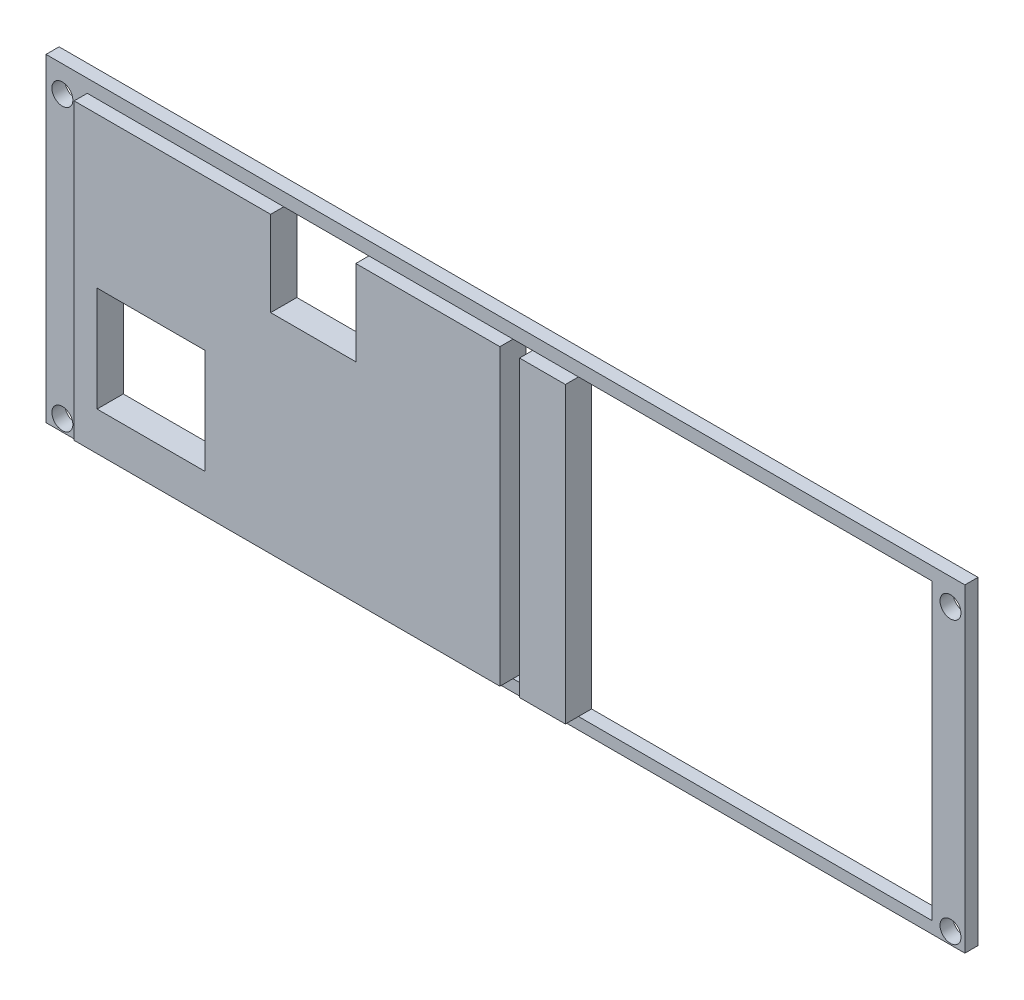
ISO-10303-21;
HEADER;
FILE_DESCRIPTION(('STEP AP214'),'2;1');
FILE_NAME('part.step','',(''),(''),'','','');
FILE_SCHEMA(('AUTOMOTIVE_DESIGN { 1 0 10303 214 1 1 1 1 }'));
ENDSEC;
DATA;
#1=APPLICATION_CONTEXT('core data for automotive mechanical design processes');
#2=APPLICATION_PROTOCOL_DEFINITION('international standard','automotive_design',2000,#1);
#3=PRODUCT_CONTEXT('',#1,'mechanical');
#4=PRODUCT('Part','Part','',(#3));
#5=PRODUCT_RELATED_PRODUCT_CATEGORY('part','',(#4));
#6=PRODUCT_DEFINITION_FORMATION('','',#4);
#7=PRODUCT_DEFINITION_CONTEXT('part definition',#1,'design');
#8=PRODUCT_DEFINITION('design','',#6,#7);
#9=PRODUCT_DEFINITION_SHAPE('','',#8);
#10=(LENGTH_UNIT() NAMED_UNIT(*) SI_UNIT(.MILLI.,.METRE.));
#11=(NAMED_UNIT(*) PLANE_ANGLE_UNIT() SI_UNIT($,.RADIAN.));
#12=(NAMED_UNIT(*) SI_UNIT($,.STERADIAN.) SOLID_ANGLE_UNIT());
#13=UNCERTAINTY_MEASURE_WITH_UNIT(LENGTH_MEASURE(1.E-05),#10,'distance_accuracy_value','');
#14=(GEOMETRIC_REPRESENTATION_CONTEXT(3) GLOBAL_UNCERTAINTY_ASSIGNED_CONTEXT((#13)) GLOBAL_UNIT_ASSIGNED_CONTEXT((#10,
#11,#12)) REPRESENTATION_CONTEXT('',''));
#15=CARTESIAN_POINT('',(0.,0.,0.));
#16=DIRECTION('',(0.,0.,1.));
#17=DIRECTION('',(1.,0.,0.));
#18=AXIS2_PLACEMENT_3D('',#15,#16,#17);
#19=CARTESIAN_POINT('',(0.,0.,0.));
#20=DIRECTION('',(0.,0.,-1.));
#21=DIRECTION('',(-1.,0.,0.));
#22=AXIS2_PLACEMENT_3D('',#19,#20,#21);
#23=PLANE('',#22);
#24=DIRECTION('',(0.,1.,0.));
#25=VECTOR('',#24,1.);
#26=CARTESIAN_POINT('',(9.8,0.,0.));
#27=LINE('',#26,#25);
#28=CARTESIAN_POINT('',(9.8,7.69999999999999,0.));
#29=VERTEX_POINT('',#28);
#30=CARTESIAN_POINT('',(9.80000000000001,23.7,0.));
#31=VERTEX_POINT('',#30);
#32=EDGE_CURVE('E219',#29,#31,#27,.T.);
#33=ORIENTED_EDGE('',*,*,#32,.F.);
#34=DIRECTION('',(-1.,0.,0.));
#35=VECTOR('',#34,1.);
#36=CARTESIAN_POINT('',(0.,7.69999999999999,0.));
#37=LINE('',#36,#35);
#38=CARTESIAN_POINT('',(26.3,7.69999999999999,0.));
#39=VERTEX_POINT('',#38);
#40=EDGE_CURVE('E224',#39,#29,#37,.T.);
#41=ORIENTED_EDGE('',*,*,#40,.F.);
#42=DIRECTION('',(0.,-1.,0.));
#43=VECTOR('',#42,1.);
#44=CARTESIAN_POINT('',(26.3,0.,0.));
#45=LINE('',#44,#43);
#46=CARTESIAN_POINT('',(26.3,23.7,0.));
#47=VERTEX_POINT('',#46);
#48=EDGE_CURVE('E220',#47,#39,#45,.T.);
#49=ORIENTED_EDGE('',*,*,#48,.F.);
#50=DIRECTION('',(-1.,0.,0.));
#51=VECTOR('',#50,1.);
#52=CARTESIAN_POINT('',(0.,23.7,0.));
#53=LINE('',#52,#51);
#54=EDGE_CURVE('E215',#47,#31,#53,.T.);
#55=ORIENTED_EDGE('',*,*,#54,.T.);
#56=EDGE_LOOP('',(#33,#41,#49,#55));
#57=FACE_BOUND('',#56,.T.);
#58=DIRECTION('',(-1.,0.,0.));
#59=VECTOR('',#58,1.);
#60=CARTESIAN_POINT('',(0.,46.7,0.));
#61=LINE('',#60,#59);
#62=CARTESIAN_POINT('',(74.3,46.7,0.));
#63=VERTEX_POINT('',#62);
#64=CARTESIAN_POINT('',(71.3,46.7,0.));
#65=VERTEX_POINT('',#64);
#66=EDGE_CURVE('E271',#63,#65,#61,.T.);
#67=ORIENTED_EDGE('',*,*,#66,.T.);
#68=DIRECTION('',(0.,-1.,0.));
#69=VECTOR('',#68,1.);
#70=CARTESIAN_POINT('',(71.3,0.,0.));
#71=LINE('',#70,#69);
#72=CARTESIAN_POINT('',(71.3,1.8,0.));
#73=VERTEX_POINT('',#72);
#74=EDGE_CURVE('E276',#65,#73,#71,.T.);
#75=ORIENTED_EDGE('',*,*,#74,.T.);
#76=DIRECTION('',(1.,0.,0.));
#77=VECTOR('',#76,1.);
#78=CARTESIAN_POINT('',(0.,1.8,0.));
#79=LINE('',#78,#77);
#80=CARTESIAN_POINT('',(74.3,1.8,0.));
#81=VERTEX_POINT('',#80);
#82=EDGE_CURVE('E54',#73,#81,#79,.T.);
#83=ORIENTED_EDGE('',*,*,#82,.T.);
#84=DIRECTION('',(0.,-1.,0.));
#85=VECTOR('',#84,1.);
#86=CARTESIAN_POINT('',(74.3,0.,0.));
#87=LINE('',#86,#85);
#88=EDGE_CURVE('E254',#63,#81,#87,.T.);
#89=ORIENTED_EDGE('',*,*,#88,.F.);
#90=EDGE_LOOP('',(#67,#75,#83,#89));
#91=FACE_BOUND('',#90,.T.);
#92=CARTESIAN_POINT('',(2.5,44.7,0.));
#93=DIRECTION('',(0.,0.,1.));
#94=DIRECTION('',(1.,0.,0.));
#95=AXIS2_PLACEMENT_3D('',#92,#93,#94);
#96=CIRCLE('',#95,1.6);
#97=CARTESIAN_POINT('',(4.1,44.7,0.));
#98=VERTEX_POINT('',#97);
#99=EDGE_CURVE('E248',#98,#98,#96,.T.);
#100=ORIENTED_EDGE('',*,*,#99,.T.);
#101=EDGE_LOOP('',(#100));
#102=FACE_BOUND('',#101,.T.);
#103=CARTESIAN_POINT('',(138.1,1.8,0.));
#104=DIRECTION('',(0.,0.,1.));
#105=DIRECTION('',(1.,0.,0.));
#106=AXIS2_PLACEMENT_3D('',#103,#104,#105);
#107=CIRCLE('',#106,1.59999999999999);
#108=CARTESIAN_POINT('',(139.7,1.8,0.));
#109=VERTEX_POINT('',#108);
#110=EDGE_CURVE('E234',#109,#109,#107,.T.);
#111=ORIENTED_EDGE('',*,*,#110,.T.);
#112=EDGE_LOOP('',(#111));
#113=FACE_BOUND('',#112,.T.);
#114=CARTESIAN_POINT('',(138.1,44.7,0.));
#115=DIRECTION('',(0.,0.,1.));
#116=DIRECTION('',(1.,0.,0.));
#117=AXIS2_PLACEMENT_3D('',#114,#115,#116);
#118=CIRCLE('',#117,1.59999999999999);
#119=CARTESIAN_POINT('',(139.7,44.7,0.));
#120=VERTEX_POINT('',#119);
#121=EDGE_CURVE('E244',#120,#120,#118,.T.);
#122=ORIENTED_EDGE('',*,*,#121,.T.);
#123=EDGE_LOOP('',(#122));
#124=FACE_BOUND('',#123,.T.);
#125=CARTESIAN_POINT('',(2.5,1.8,0.));
#126=DIRECTION('',(0.,0.,1.));
#127=DIRECTION('',(1.,0.,0.));
#128=AXIS2_PLACEMENT_3D('',#125,#126,#127);
#129=CIRCLE('',#128,1.6);
#130=CARTESIAN_POINT('',(4.1,1.8,0.));
#131=VERTEX_POINT('',#130);
#132=EDGE_CURVE('E245',#131,#131,#129,.T.);
#133=ORIENTED_EDGE('',*,*,#132,.T.);
#134=EDGE_LOOP('',(#133));
#135=FACE_BOUND('',#134,.T.);
#136=DIRECTION('',(-1.,0.,0.));
#137=VECTOR('',#136,1.);
#138=CARTESIAN_POINT('',(0.,46.7,0.));
#139=LINE('',#138,#137);
#140=CARTESIAN_POINT('',(135.3,46.7,0.));
#141=VERTEX_POINT('',#140);
#142=CARTESIAN_POINT('',(81.3,46.7,0.));
#143=VERTEX_POINT('',#142);
#144=EDGE_CURVE('E324',#141,#143,#139,.T.);
#145=ORIENTED_EDGE('',*,*,#144,.T.);
#146=DIRECTION('',(0.,-1.,0.));
#147=VECTOR('',#146,1.);
#148=CARTESIAN_POINT('',(81.3,0.,0.));
#149=LINE('',#148,#147);
#150=CARTESIAN_POINT('',(81.3,1.8,0.));
#151=VERTEX_POINT('',#150);
#152=EDGE_CURVE('E327',#143,#151,#149,.T.);
#153=ORIENTED_EDGE('',*,*,#152,.T.);
#154=DIRECTION('',(1.,0.,0.));
#155=VECTOR('',#154,1.);
#156=CARTESIAN_POINT('',(0.,1.8,0.));
#157=LINE('',#156,#155);
#158=CARTESIAN_POINT('',(135.3,1.8,0.));
#159=VERTEX_POINT('',#158);
#160=EDGE_CURVE('E330',#151,#159,#157,.T.);
#161=ORIENTED_EDGE('',*,*,#160,.T.);
#162=DIRECTION('',(0.,1.,0.));
#163=VECTOR('',#162,1.);
#164=CARTESIAN_POINT('',(135.3,0.,0.));
#165=LINE('',#164,#163);
#166=EDGE_CURVE('E333',#159,#141,#165,.T.);
#167=ORIENTED_EDGE('',*,*,#166,.T.);
#168=EDGE_LOOP('',(#145,#153,#161,#167));
#169=FACE_BOUND('',#168,.T.);
#170=DIRECTION('',(0.,-1.,0.));
#171=VECTOR('',#170,1.);
#172=CARTESIAN_POINT('',(0.,0.,0.));
#173=LINE('',#172,#171);
#174=CARTESIAN_POINT('',(0.,48.7,0.));
#175=VERTEX_POINT('',#174);
#176=CARTESIAN_POINT('',(0.,0.,0.));
#177=VERTEX_POINT('',#176);
#178=EDGE_CURVE('E410',#175,#177,#173,.T.);
#179=ORIENTED_EDGE('',*,*,#178,.F.);
#180=DIRECTION('',(-1.,0.,0.));
#181=VECTOR('',#180,1.);
#182=CARTESIAN_POINT('',(0.,48.7,0.));
#183=LINE('',#182,#181);
#184=CARTESIAN_POINT('',(140.3,48.7,0.));
#185=VERTEX_POINT('',#184);
#186=EDGE_CURVE('E420',#185,#175,#183,.T.);
#187=ORIENTED_EDGE('',*,*,#186,.F.);
#188=DIRECTION('',(0.,1.,0.));
#189=VECTOR('',#188,1.);
#190=CARTESIAN_POINT('',(140.3,0.,0.));
#191=LINE('',#190,#189);
#192=CARTESIAN_POINT('',(140.3,0.,0.));
#193=VERTEX_POINT('',#192);
#194=EDGE_CURVE('E417',#193,#185,#191,.T.);
#195=ORIENTED_EDGE('',*,*,#194,.F.);
#196=DIRECTION('',(1.,0.,0.));
#197=VECTOR('',#196,1.);
#198=CARTESIAN_POINT('',(0.,0.,0.));
#199=LINE('',#198,#197);
#200=EDGE_CURVE('E414',#177,#193,#199,.T.);
#201=ORIENTED_EDGE('',*,*,#200,.F.);
#202=EDGE_LOOP('',(#179,#187,#195,#201));
#203=FACE_BOUND('',#202,.T.);
#204=DIRECTION('',(-1.,0.,0.));
#205=VECTOR('',#204,1.);
#206=CARTESIAN_POINT('',(0.,46.7,0.));
#207=LINE('',#206,#205);
#208=CARTESIAN_POINT('',(49.3,46.7,0.));
#209=VERTEX_POINT('',#208);
#210=CARTESIAN_POINT('',(36.3,46.7,0.));
#211=VERTEX_POINT('',#210);
#212=EDGE_CURVE('E284',#209,#211,#207,.T.);
#213=ORIENTED_EDGE('',*,*,#212,.T.);
#214=DIRECTION('',(0.,1.,0.));
#215=VECTOR('',#214,1.);
#216=CARTESIAN_POINT('',(36.3,0.,0.));
#217=LINE('',#216,#215);
#218=CARTESIAN_POINT('',(36.3,33.7,0.));
#219=VERTEX_POINT('',#218);
#220=EDGE_CURVE('E298',#219,#211,#217,.T.);
#221=ORIENTED_EDGE('',*,*,#220,.F.);
#222=DIRECTION('',(-1.,0.,0.));
#223=VECTOR('',#222,1.);
#224=CARTESIAN_POINT('',(0.,33.7,0.));
#225=LINE('',#224,#223);
#226=CARTESIAN_POINT('',(49.3,33.7,0.));
#227=VERTEX_POINT('',#226);
#228=EDGE_CURVE('E308',#227,#219,#225,.T.);
#229=ORIENTED_EDGE('',*,*,#228,.F.);
#230=DIRECTION('',(0.,-1.,0.));
#231=VECTOR('',#230,1.);
#232=CARTESIAN_POINT('',(49.3,0.,0.));
#233=LINE('',#232,#231);
#234=EDGE_CURVE('E306',#209,#227,#233,.T.);
#235=ORIENTED_EDGE('',*,*,#234,.F.);
#236=EDGE_LOOP('',(#213,#221,#229,#235));
#237=FACE_BOUND('',#236,.T.);
#238=ADVANCED_FACE('F39',(#57,#91,#102,#113,#124,#135,#169,#203,#237),#23,.T.);
#239=CARTESIAN_POINT('',(0.,46.7,2.));
#240=DIRECTION('',(0.,-1.,0.));
#241=DIRECTION('',(0.,0.,-1.));
#242=AXIS2_PLACEMENT_3D('',#239,#240,#241);
#243=PLANE('',#242);
#244=DIRECTION('',(0.,0.,1.));
#245=VECTOR('',#244,1.);
#246=CARTESIAN_POINT('',(74.3,46.7,0.));
#247=LINE('',#246,#245);
#248=CARTESIAN_POINT('',(74.3,46.7,2.));
#249=VERTEX_POINT('',#248);
#250=CARTESIAN_POINT('',(74.3,46.7,4.));
#251=VERTEX_POINT('',#250);
#252=EDGE_CURVE('E266',#249,#251,#247,.T.);
#253=ORIENTED_EDGE('',*,*,#252,.T.);
#254=DIRECTION('',(1.,0.,0.));
#255=VECTOR('',#254,1.);
#256=CARTESIAN_POINT('',(0.,46.7,4.));
#257=LINE('',#256,#255);
#258=CARTESIAN_POINT('',(81.3,46.7,4.));
#259=VERTEX_POINT('',#258);
#260=EDGE_CURVE('E404',#251,#259,#257,.T.);
#261=ORIENTED_EDGE('',*,*,#260,.T.);
#262=DIRECTION('',(0.,0.,1.));
#263=VECTOR('',#262,1.);
#264=CARTESIAN_POINT('',(81.3,46.7,0.));
#265=LINE('',#264,#263);
#266=CARTESIAN_POINT('',(81.3,46.7,2.));
#267=VERTEX_POINT('',#266);
#268=EDGE_CURVE('E336',#267,#259,#265,.T.);
#269=ORIENTED_EDGE('',*,*,#268,.F.);
#270=DIRECTION('',(1.,0.,0.));
#271=VECTOR('',#270,1.);
#272=CARTESIAN_POINT('',(0.,46.7,2.));
#273=LINE('',#272,#271);
#274=EDGE_CURVE('E384',#249,#267,#273,.T.);
#275=ORIENTED_EDGE('',*,*,#274,.F.);
#276=EDGE_LOOP('',(#253,#261,#269,#275));
#277=FACE_BOUND('',#276,.T.);
#278=ADVANCED_FACE('F471',(#277),#243,.F.);
#279=DIRECTION('',(0.,0.,1.));
#280=VECTOR('',#279,1.);
#281=CARTESIAN_POINT('',(36.3,46.7,0.));
#282=LINE('',#281,#280);
#283=CARTESIAN_POINT('',(36.3,46.7,2.));
#284=VERTEX_POINT('',#283);
#285=CARTESIAN_POINT('',(36.3,46.7,4.));
#286=VERTEX_POINT('',#285);
#287=EDGE_CURVE('E293',#284,#286,#282,.T.);
#288=ORIENTED_EDGE('',*,*,#287,.F.);
#289=CARTESIAN_POINT('',(6.3,46.7,2.));
#290=VERTEX_POINT('',#289);
#291=EDGE_CURVE('E385',#290,#284,#273,.T.);
#292=ORIENTED_EDGE('',*,*,#291,.F.);
#293=DIRECTION('',(0.,0.,1.));
#294=VECTOR('',#293,1.);
#295=CARTESIAN_POINT('',(6.3,46.7,2.));
#296=LINE('',#295,#294);
#297=CARTESIAN_POINT('',(6.3,46.7,4.));
#298=VERTEX_POINT('',#297);
#299=EDGE_CURVE('E408',#290,#298,#296,.T.);
#300=ORIENTED_EDGE('',*,*,#299,.T.);
#301=EDGE_CURVE('E377',#298,#286,#257,.T.);
#302=ORIENTED_EDGE('',*,*,#301,.T.);
#303=EDGE_LOOP('',(#288,#292,#300,#302));
#304=FACE_BOUND('',#303,.T.);
#305=ADVANCED_FACE('F478',(#304),#243,.F.);
#306=CARTESIAN_POINT('',(49.3,46.7,4.));
#307=VERTEX_POINT('',#306);
#308=CARTESIAN_POINT('',(71.3,46.7,4.));
#309=VERTEX_POINT('',#308);
#310=EDGE_CURVE('E407',#307,#309,#257,.T.);
#311=ORIENTED_EDGE('',*,*,#310,.T.);
#312=DIRECTION('',(0.,0.,1.));
#313=VECTOR('',#312,1.);
#314=CARTESIAN_POINT('',(71.3,46.7,0.));
#315=LINE('',#314,#313);
#316=CARTESIAN_POINT('',(71.3,46.7,2.));
#317=VERTEX_POINT('',#316);
#318=EDGE_CURVE('E255',#317,#309,#315,.T.);
#319=ORIENTED_EDGE('',*,*,#318,.F.);
#320=CARTESIAN_POINT('',(49.3,46.7,2.));
#321=VERTEX_POINT('',#320);
#322=EDGE_CURVE('E389',#321,#317,#273,.T.);
#323=ORIENTED_EDGE('',*,*,#322,.F.);
#324=DIRECTION('',(0.,0.,1.));
#325=VECTOR('',#324,1.);
#326=CARTESIAN_POINT('',(49.3,46.7,0.));
#327=LINE('',#326,#325);
#328=EDGE_CURVE('E289',#321,#307,#327,.T.);
#329=ORIENTED_EDGE('',*,*,#328,.T.);
#330=EDGE_LOOP('',(#311,#319,#323,#329));
#331=FACE_BOUND('',#330,.T.);
#332=ADVANCED_FACE('F480',(#331),#243,.F.);
#333=CARTESIAN_POINT('',(0.,1.8,2.));
#334=DIRECTION('',(0.,-1.,0.));
#335=DIRECTION('',(0.,0.,-1.));
#336=AXIS2_PLACEMENT_3D('',#333,#334,#335);
#337=PLANE('',#336);
#338=DIRECTION('',(1.,0.,0.));
#339=VECTOR('',#338,1.);
#340=CARTESIAN_POINT('',(0.,1.8,4.));
#341=LINE('',#340,#339);
#342=CARTESIAN_POINT('',(74.3,1.8,4.));
#343=VERTEX_POINT('',#342);
#344=CARTESIAN_POINT('',(81.3,1.8,4.));
#345=VERTEX_POINT('',#344);
#346=EDGE_CURVE('E373',#343,#345,#341,.T.);
#347=ORIENTED_EDGE('',*,*,#346,.F.);
#348=DIRECTION('',(0.,0.,1.));
#349=VECTOR('',#348,1.);
#350=CARTESIAN_POINT('',(74.3,1.8,0.));
#351=LINE('',#350,#349);
#352=CARTESIAN_POINT('',(74.3,1.8,2.));
#353=VERTEX_POINT('',#352);
#354=EDGE_CURVE('E262',#353,#343,#351,.T.);
#355=ORIENTED_EDGE('',*,*,#354,.F.);
#356=DIRECTION('',(1.,0.,0.));
#357=VECTOR('',#356,1.);
#358=CARTESIAN_POINT('',(0.,1.8,2.));
#359=LINE('',#358,#357);
#360=CARTESIAN_POINT('',(81.3,1.8,2.));
#361=VERTEX_POINT('',#360);
#362=EDGE_CURVE('E376',#353,#361,#359,.T.);
#363=ORIENTED_EDGE('',*,*,#362,.T.);
#364=DIRECTION('',(0.,0.,1.));
#365=VECTOR('',#364,1.);
#366=CARTESIAN_POINT('',(81.3,1.8,0.));
#367=LINE('',#366,#365);
#368=EDGE_CURVE('E348',#361,#345,#367,.T.);
#369=ORIENTED_EDGE('',*,*,#368,.T.);
#370=EDGE_LOOP('',(#347,#355,#363,#369));
#371=FACE_BOUND('',#370,.T.);
#372=ADVANCED_FACE('F466',(#371),#337,.T.);
#373=CARTESIAN_POINT('',(0.,0.,4.));
#374=DIRECTION('',(0.,0.,-1.));
#375=DIRECTION('',(-1.,0.,0.));
#376=AXIS2_PLACEMENT_3D('',#373,#374,#375);
#377=PLANE('',#376);
#378=DIRECTION('',(0.,-1.,0.));
#379=VECTOR('',#378,1.);
#380=CARTESIAN_POINT('',(74.3,0.,4.));
#381=LINE('',#380,#379);
#382=EDGE_CURVE('E267',#251,#343,#381,.T.);
#383=ORIENTED_EDGE('',*,*,#382,.T.);
#384=ORIENTED_EDGE('',*,*,#346,.T.);
#385=DIRECTION('',(0.,-1.,0.));
#386=VECTOR('',#385,1.);
#387=CARTESIAN_POINT('',(81.3,0.,4.));
#388=LINE('',#387,#386);
#389=EDGE_CURVE('E273',#259,#345,#388,.T.);
#390=ORIENTED_EDGE('',*,*,#389,.F.);
#391=ORIENTED_EDGE('',*,*,#260,.F.);
#392=EDGE_LOOP('',(#383,#384,#390,#391));
#393=FACE_BOUND('',#392,.T.);
#394=ADVANCED_FACE('F483',(#393),#377,.F.);
#395=DIRECTION('',(-1.,0.,0.));
#396=VECTOR('',#395,1.);
#397=CARTESIAN_POINT('',(0.,7.69999999999999,4.));
#398=LINE('',#397,#396);
#399=CARTESIAN_POINT('',(26.3,7.69999999999999,4.));
#400=VERTEX_POINT('',#399);
#401=CARTESIAN_POINT('',(9.8,7.69999999999999,4.));
#402=VERTEX_POINT('',#401);
#403=EDGE_CURVE('E317',#400,#402,#398,.T.);
#404=ORIENTED_EDGE('',*,*,#403,.T.);
#405=DIRECTION('',(0.,1.,0.));
#406=VECTOR('',#405,1.);
#407=CARTESIAN_POINT('',(9.8,0.,4.));
#408=LINE('',#407,#406);
#409=CARTESIAN_POINT('',(9.80000000000001,23.7,4.));
#410=VERTEX_POINT('',#409);
#411=EDGE_CURVE('E11',#402,#410,#408,.T.);
#412=ORIENTED_EDGE('',*,*,#411,.T.);
#413=DIRECTION('',(-1.,0.,0.));
#414=VECTOR('',#413,1.);
#415=CARTESIAN_POINT('',(0.,23.7,4.));
#416=LINE('',#415,#414);
#417=CARTESIAN_POINT('',(26.3,23.7,4.));
#418=VERTEX_POINT('',#417);
#419=EDGE_CURVE('E238',#418,#410,#416,.T.);
#420=ORIENTED_EDGE('',*,*,#419,.F.);
#421=DIRECTION('',(0.,-1.,0.));
#422=VECTOR('',#421,1.);
#423=CARTESIAN_POINT('',(26.3,0.,4.));
#424=LINE('',#423,#422);
#425=EDGE_CURVE('E223',#418,#400,#424,.T.);
#426=ORIENTED_EDGE('',*,*,#425,.T.);
#427=EDGE_LOOP('',(#404,#412,#420,#426));
#428=FACE_BOUND('',#427,.T.);
#429=CARTESIAN_POINT('',(6.3,1.8,4.));
#430=VERTEX_POINT('',#429);
#431=CARTESIAN_POINT('',(71.3,1.8,4.));
#432=VERTEX_POINT('',#431);
#433=EDGE_CURVE('E398',#430,#432,#341,.T.);
#434=ORIENTED_EDGE('',*,*,#433,.T.);
#435=DIRECTION('',(0.,-1.,0.));
#436=VECTOR('',#435,1.);
#437=CARTESIAN_POINT('',(71.3,0.,4.));
#438=LINE('',#437,#436);
#439=EDGE_CURVE('E270',#309,#432,#438,.T.);
#440=ORIENTED_EDGE('',*,*,#439,.F.);
#441=ORIENTED_EDGE('',*,*,#310,.F.);
#442=DIRECTION('',(0.,-1.,0.));
#443=VECTOR('',#442,1.);
#444=CARTESIAN_POINT('',(49.3,0.,4.));
#445=LINE('',#444,#443);
#446=CARTESIAN_POINT('',(49.3,33.7,4.));
#447=VERTEX_POINT('',#446);
#448=EDGE_CURVE('E294',#307,#447,#445,.T.);
#449=ORIENTED_EDGE('',*,*,#448,.T.);
#450=DIRECTION('',(-1.,0.,0.));
#451=VECTOR('',#450,1.);
#452=CARTESIAN_POINT('',(0.,33.7,4.));
#453=LINE('',#452,#451);
#454=CARTESIAN_POINT('',(36.3,33.7,4.));
#455=VERTEX_POINT('',#454);
#456=EDGE_CURVE('E297',#447,#455,#453,.T.);
#457=ORIENTED_EDGE('',*,*,#456,.T.);
#458=DIRECTION('',(0.,1.,0.));
#459=VECTOR('',#458,1.);
#460=CARTESIAN_POINT('',(36.3,0.,4.));
#461=LINE('',#460,#459);
#462=EDGE_CURVE('E301',#455,#286,#461,.T.);
#463=ORIENTED_EDGE('',*,*,#462,.T.);
#464=ORIENTED_EDGE('',*,*,#301,.F.);
#465=DIRECTION('',(0.,1.,0.));
#466=VECTOR('',#465,1.);
#467=CARTESIAN_POINT('',(6.3,0.,4.));
#468=LINE('',#467,#466);
#469=EDGE_CURVE('E401',#430,#298,#468,.T.);
#470=ORIENTED_EDGE('',*,*,#469,.F.);
#471=EDGE_LOOP('',(#434,#440,#441,#449,#457,#463,#464,#470));
#472=FACE_BOUND('',#471,.T.);
#473=ADVANCED_FACE('F491',(#428,#472),#377,.F.);
#474=CARTESIAN_POINT('',(0.,0.,4.));
#475=DIRECTION('',(1.,0.,0.));
#476=DIRECTION('',(0.,0.,-1.));
#477=AXIS2_PLACEMENT_3D('',#474,#475,#476);
#478=PLANE('',#477);
#479=DIRECTION('',(0.,-1.,0.));
#480=VECTOR('',#479,1.);
#481=CARTESIAN_POINT('',(0.,0.,2.));
#482=LINE('',#481,#480);
#483=CARTESIAN_POINT('',(0.,48.7,2.));
#484=VERTEX_POINT('',#483);
#485=CARTESIAN_POINT('',(0.,0.,2.));
#486=VERTEX_POINT('',#485);
#487=EDGE_CURVE('E391',#484,#486,#482,.T.);
#488=ORIENTED_EDGE('',*,*,#487,.F.);
#489=DIRECTION('',(0.,0.,-1.));
#490=VECTOR('',#489,1.);
#491=CARTESIAN_POINT('',(0.,48.7,4.));
#492=LINE('',#491,#490);
#493=EDGE_CURVE('E423',#484,#175,#492,.T.);
#494=ORIENTED_EDGE('',*,*,#493,.T.);
#495=ORIENTED_EDGE('',*,*,#178,.T.);
#496=DIRECTION('',(0.,0.,-1.));
#497=VECTOR('',#496,1.);
#498=CARTESIAN_POINT('',(0.,0.,4.));
#499=LINE('',#498,#497);
#500=EDGE_CURVE('E47',#486,#177,#499,.T.);
#501=ORIENTED_EDGE('',*,*,#500,.F.);
#502=EDGE_LOOP('',(#488,#494,#495,#501));
#503=FACE_BOUND('',#502,.T.);
#504=ADVANCED_FACE('F41',(#503),#478,.F.);
#505=CARTESIAN_POINT('',(0.,0.,4.));
#506=DIRECTION('',(0.,1.,0.));
#507=DIRECTION('',(0.,0.,1.));
#508=AXIS2_PLACEMENT_3D('',#505,#506,#507);
#509=PLANE('',#508);
#510=DIRECTION('',(1.,0.,0.));
#511=VECTOR('',#510,1.);
#512=CARTESIAN_POINT('',(0.,0.,2.));
#513=LINE('',#512,#511);
#514=CARTESIAN_POINT('',(140.3,0.,2.));
#515=VERTEX_POINT('',#514);
#516=EDGE_CURVE('E393',#486,#515,#513,.T.);
#517=ORIENTED_EDGE('',*,*,#516,.F.);
#518=ORIENTED_EDGE('',*,*,#500,.T.);
#519=ORIENTED_EDGE('',*,*,#200,.T.);
#520=DIRECTION('',(0.,0.,-1.));
#521=VECTOR('',#520,1.);
#522=CARTESIAN_POINT('',(140.3,0.,4.));
#523=LINE('',#522,#521);
#524=EDGE_CURVE('E427',#515,#193,#523,.T.);
#525=ORIENTED_EDGE('',*,*,#524,.F.);
#526=EDGE_LOOP('',(#517,#518,#519,#525));
#527=FACE_BOUND('',#526,.T.);
#528=ADVANCED_FACE('F432',(#527),#509,.F.);
#529=CARTESIAN_POINT('',(140.3,0.,4.));
#530=DIRECTION('',(-1.,0.,0.));
#531=DIRECTION('',(0.,0.,1.));
#532=AXIS2_PLACEMENT_3D('',#529,#530,#531);
#533=PLANE('',#532);
#534=DIRECTION('',(0.,1.,0.));
#535=VECTOR('',#534,1.);
#536=CARTESIAN_POINT('',(140.3,0.,2.));
#537=LINE('',#536,#535);
#538=CARTESIAN_POINT('',(140.3,48.7,2.));
#539=VERTEX_POINT('',#538);
#540=EDGE_CURVE('E395',#515,#539,#537,.T.);
#541=ORIENTED_EDGE('',*,*,#540,.F.);
#542=ORIENTED_EDGE('',*,*,#524,.T.);
#543=ORIENTED_EDGE('',*,*,#194,.T.);
#544=DIRECTION('',(0.,0.,-1.));
#545=VECTOR('',#544,1.);
#546=CARTESIAN_POINT('',(140.3,48.7,4.));
#547=LINE('',#546,#545);
#548=EDGE_CURVE('E425',#539,#185,#547,.T.);
#549=ORIENTED_EDGE('',*,*,#548,.F.);
#550=EDGE_LOOP('',(#541,#542,#543,#549));
#551=FACE_BOUND('',#550,.T.);
#552=ADVANCED_FACE('F448',(#551),#533,.F.);
#553=CARTESIAN_POINT('',(0.,48.7,4.));
#554=DIRECTION('',(0.,-1.,0.));
#555=DIRECTION('',(0.,0.,-1.));
#556=AXIS2_PLACEMENT_3D('',#553,#554,#555);
#557=PLANE('',#556);
#558=DIRECTION('',(-1.,0.,0.));
#559=VECTOR('',#558,1.);
#560=CARTESIAN_POINT('',(0.,48.7,2.));
#561=LINE('',#560,#559);
#562=EDGE_CURVE('E388',#539,#484,#561,.T.);
#563=ORIENTED_EDGE('',*,*,#562,.F.);
#564=ORIENTED_EDGE('',*,*,#548,.T.);
#565=ORIENTED_EDGE('',*,*,#186,.T.);
#566=ORIENTED_EDGE('',*,*,#493,.F.);
#567=EDGE_LOOP('',(#563,#564,#565,#566));
#568=FACE_BOUND('',#567,.T.);
#569=ADVANCED_FACE('F444',(#568),#557,.F.);
#570=CARTESIAN_POINT('',(6.3,0.,2.));
#571=DIRECTION('',(1.,0.,0.));
#572=DIRECTION('',(0.,0.,-1.));
#573=AXIS2_PLACEMENT_3D('',#570,#571,#572);
#574=PLANE('',#573);
#575=ORIENTED_EDGE('',*,*,#469,.T.);
#576=ORIENTED_EDGE('',*,*,#299,.F.);
#577=DIRECTION('',(0.,1.,0.));
#578=VECTOR('',#577,1.);
#579=CARTESIAN_POINT('',(6.3,0.,2.));
#580=LINE('',#579,#578);
#581=CARTESIAN_POINT('',(6.3,1.8,2.));
#582=VERTEX_POINT('',#581);
#583=EDGE_CURVE('E381',#582,#290,#580,.T.);
#584=ORIENTED_EDGE('',*,*,#583,.F.);
#585=DIRECTION('',(0.,0.,1.));
#586=VECTOR('',#585,1.);
#587=CARTESIAN_POINT('',(6.3,1.8,2.));
#588=LINE('',#587,#586);
#589=EDGE_CURVE('E397',#582,#430,#588,.T.);
#590=ORIENTED_EDGE('',*,*,#589,.T.);
#591=EDGE_LOOP('',(#575,#576,#584,#590));
#592=FACE_BOUND('',#591,.T.);
#593=ADVANCED_FACE('F463',(#592),#574,.F.);
#594=DIRECTION('',(0.,0.,1.));
#595=VECTOR('',#594,1.);
#596=CARTESIAN_POINT('',(71.3,1.8,0.));
#597=LINE('',#596,#595);
#598=CARTESIAN_POINT('',(71.3,1.8,2.));
#599=VERTEX_POINT('',#598);
#600=EDGE_CURVE('E258',#599,#432,#597,.T.);
#601=ORIENTED_EDGE('',*,*,#600,.T.);
#602=ORIENTED_EDGE('',*,*,#433,.F.);
#603=ORIENTED_EDGE('',*,*,#589,.F.);
#604=EDGE_CURVE('E378',#582,#599,#359,.T.);
#605=ORIENTED_EDGE('',*,*,#604,.T.);
#606=EDGE_LOOP('',(#601,#602,#603,#605));
#607=FACE_BOUND('',#606,.T.);
#608=ADVANCED_FACE('F453',(#607),#337,.T.);
#609=CARTESIAN_POINT('',(0.,0.,2.));
#610=DIRECTION('',(0.,0.,1.));
#611=DIRECTION('',(1.,0.,0.));
#612=AXIS2_PLACEMENT_3D('',#609,#610,#611);
#613=PLANE('',#612);
#614=CARTESIAN_POINT('',(138.1,1.8,2.));
#615=DIRECTION('',(0.,0.,1.));
#616=DIRECTION('',(1.,0.,0.));
#617=AXIS2_PLACEMENT_3D('',#614,#615,#616);
#618=CIRCLE('',#617,1.59999999999999);
#619=CARTESIAN_POINT('',(139.7,1.8,2.));
#620=VERTEX_POINT('',#619);
#621=EDGE_CURVE('E341',#620,#620,#618,.T.);
#622=ORIENTED_EDGE('',*,*,#621,.F.);
#623=EDGE_LOOP('',(#622));
#624=FACE_BOUND('',#623,.T.);
#625=CARTESIAN_POINT('',(138.1,44.7,2.));
#626=DIRECTION('',(0.,0.,1.));
#627=DIRECTION('',(1.,0.,0.));
#628=AXIS2_PLACEMENT_3D('',#625,#626,#627);
#629=CIRCLE('',#628,1.59999999999999);
#630=CARTESIAN_POINT('',(139.7,44.7,2.));
#631=VERTEX_POINT('',#630);
#632=EDGE_CURVE('E370',#631,#631,#629,.T.);
#633=ORIENTED_EDGE('',*,*,#632,.F.);
#634=EDGE_LOOP('',(#633));
#635=FACE_BOUND('',#634,.T.);
#636=CARTESIAN_POINT('',(2.5,1.8,2.));
#637=DIRECTION('',(0.,0.,1.));
#638=DIRECTION('',(1.,0.,0.));
#639=AXIS2_PLACEMENT_3D('',#636,#637,#638);
#640=CIRCLE('',#639,1.6);
#641=CARTESIAN_POINT('',(4.1,1.8,2.));
#642=VERTEX_POINT('',#641);
#643=EDGE_CURVE('E367',#642,#642,#640,.T.);
#644=ORIENTED_EDGE('',*,*,#643,.F.);
#645=EDGE_LOOP('',(#644));
#646=FACE_BOUND('',#645,.T.);
#647=CARTESIAN_POINT('',(2.5,44.7,2.));
#648=DIRECTION('',(0.,0.,1.));
#649=DIRECTION('',(1.,0.,0.));
#650=AXIS2_PLACEMENT_3D('',#647,#648,#649);
#651=CIRCLE('',#650,1.6);
#652=CARTESIAN_POINT('',(4.1,44.7,2.));
#653=VERTEX_POINT('',#652);
#654=EDGE_CURVE('E364',#653,#653,#651,.T.);
#655=ORIENTED_EDGE('',*,*,#654,.F.);
#656=EDGE_LOOP('',(#655));
#657=FACE_BOUND('',#656,.T.);
#658=DIRECTION('',(0.,1.,0.));
#659=VECTOR('',#658,1.);
#660=CARTESIAN_POINT('',(135.3,0.,2.));
#661=LINE('',#660,#659);
#662=CARTESIAN_POINT('',(135.3,1.8,2.));
#663=VERTEX_POINT('',#662);
#664=CARTESIAN_POINT('',(135.3,46.7,2.));
#665=VERTEX_POINT('',#664);
#666=EDGE_CURVE('E374',#663,#665,#661,.T.);
#667=ORIENTED_EDGE('',*,*,#666,.F.);
#668=DIRECTION('',(1.,0.,0.));
#669=VECTOR('',#668,1.);
#670=CARTESIAN_POINT('',(0.,1.8,2.));
#671=LINE('',#670,#669);
#672=EDGE_CURVE('E354',#361,#663,#671,.T.);
#673=ORIENTED_EDGE('',*,*,#672,.F.);
#674=ORIENTED_EDGE('',*,*,#362,.F.);
#675=DIRECTION('',(1.,0.,0.));
#676=VECTOR('',#675,1.);
#677=CARTESIAN_POINT('',(0.,1.8,2.));
#678=LINE('',#677,#676);
#679=EDGE_CURVE('E360',#599,#353,#678,.T.);
#680=ORIENTED_EDGE('',*,*,#679,.F.);
#681=ORIENTED_EDGE('',*,*,#604,.F.);
#682=ORIENTED_EDGE('',*,*,#583,.T.);
#683=ORIENTED_EDGE('',*,*,#291,.T.);
#684=DIRECTION('',(-1.,0.,0.));
#685=VECTOR('',#684,1.);
#686=CARTESIAN_POINT('',(0.,46.7,2.));
#687=LINE('',#686,#685);
#688=EDGE_CURVE('E358',#321,#284,#687,.T.);
#689=ORIENTED_EDGE('',*,*,#688,.F.);
#690=ORIENTED_EDGE('',*,*,#322,.T.);
#691=DIRECTION('',(-1.,0.,0.));
#692=VECTOR('',#691,1.);
#693=CARTESIAN_POINT('',(0.,46.7,2.));
#694=LINE('',#693,#692);
#695=EDGE_CURVE('E362',#249,#317,#694,.T.);
#696=ORIENTED_EDGE('',*,*,#695,.F.);
#697=ORIENTED_EDGE('',*,*,#274,.T.);
#698=DIRECTION('',(-1.,0.,0.));
#699=VECTOR('',#698,1.);
#700=CARTESIAN_POINT('',(0.,46.7,2.));
#701=LINE('',#700,#699);
#702=EDGE_CURVE('E356',#665,#267,#701,.T.);
#703=ORIENTED_EDGE('',*,*,#702,.F.);
#704=EDGE_LOOP('',(#667,#673,#674,#680,#681,#682,#683,#689,#690,#696,#697,#703));
#705=FACE_BOUND('',#704,.T.);
#706=ORIENTED_EDGE('',*,*,#562,.T.);
#707=ORIENTED_EDGE('',*,*,#487,.T.);
#708=ORIENTED_EDGE('',*,*,#516,.T.);
#709=ORIENTED_EDGE('',*,*,#540,.T.);
#710=EDGE_LOOP('',(#706,#707,#708,#709));
#711=FACE_BOUND('',#710,.T.);
#712=ADVANCED_FACE('F450',(#624,#635,#646,#657,#705,#711),#613,.T.);
#713=CARTESIAN_POINT('',(0.,46.7,0.));
#714=DIRECTION('',(0.,1.,0.));
#715=DIRECTION('',(0.,0.,1.));
#716=AXIS2_PLACEMENT_3D('',#713,#714,#715);
#717=PLANE('',#716);
#718=ORIENTED_EDGE('',*,*,#702,.T.);
#719=EDGE_CURVE('E349',#143,#267,#265,.T.);
#720=ORIENTED_EDGE('',*,*,#719,.F.);
#721=ORIENTED_EDGE('',*,*,#144,.F.);
#722=DIRECTION('',(0.,0.,1.));
#723=VECTOR('',#722,1.);
#724=CARTESIAN_POINT('',(135.3,46.7,0.));
#725=LINE('',#724,#723);
#726=EDGE_CURVE('E338',#141,#665,#725,.T.);
#727=ORIENTED_EDGE('',*,*,#726,.T.);
#728=EDGE_LOOP('',(#718,#720,#721,#727));
#729=FACE_BOUND('',#728,.T.);
#730=ADVANCED_FACE('F452',(#729),#717,.F.);
#731=CARTESIAN_POINT('',(135.3,0.,0.));
#732=DIRECTION('',(1.,0.,0.));
#733=DIRECTION('',(0.,0.,-1.));
#734=AXIS2_PLACEMENT_3D('',#731,#732,#733);
#735=PLANE('',#734);
#736=ORIENTED_EDGE('',*,*,#666,.T.);
#737=ORIENTED_EDGE('',*,*,#726,.F.);
#738=ORIENTED_EDGE('',*,*,#166,.F.);
#739=DIRECTION('',(0.,0.,1.));
#740=VECTOR('',#739,1.);
#741=CARTESIAN_POINT('',(135.3,1.8,0.));
#742=LINE('',#741,#740);
#743=EDGE_CURVE('E342',#159,#663,#742,.T.);
#744=ORIENTED_EDGE('',*,*,#743,.T.);
#745=EDGE_LOOP('',(#736,#737,#738,#744));
#746=FACE_BOUND('',#745,.T.);
#747=ADVANCED_FACE('F460',(#746),#735,.F.);
#748=CARTESIAN_POINT('',(0.,1.8,0.));
#749=DIRECTION('',(0.,-1.,0.));
#750=DIRECTION('',(0.,0.,-1.));
#751=AXIS2_PLACEMENT_3D('',#748,#749,#750);
#752=PLANE('',#751);
#753=ORIENTED_EDGE('',*,*,#672,.T.);
#754=ORIENTED_EDGE('',*,*,#743,.F.);
#755=ORIENTED_EDGE('',*,*,#160,.F.);
#756=EDGE_CURVE('E345',#151,#361,#367,.T.);
#757=ORIENTED_EDGE('',*,*,#756,.T.);
#758=EDGE_LOOP('',(#753,#754,#755,#757));
#759=FACE_BOUND('',#758,.T.);
#760=ADVANCED_FACE('F650',(#759),#752,.F.);
#761=CARTESIAN_POINT('',(81.3,0.,0.));
#762=DIRECTION('',(-1.,0.,0.));
#763=DIRECTION('',(0.,0.,1.));
#764=AXIS2_PLACEMENT_3D('',#761,#762,#763);
#765=PLANE('',#764);
#766=ORIENTED_EDGE('',*,*,#389,.T.);
#767=ORIENTED_EDGE('',*,*,#368,.F.);
#768=ORIENTED_EDGE('',*,*,#756,.F.);
#769=ORIENTED_EDGE('',*,*,#152,.F.);
#770=ORIENTED_EDGE('',*,*,#719,.T.);
#771=ORIENTED_EDGE('',*,*,#268,.T.);
#772=EDGE_LOOP('',(#766,#767,#768,#769,#770,#771));
#773=FACE_BOUND('',#772,.T.);
#774=ADVANCED_FACE('F663',(#773),#765,.F.);
#775=CARTESIAN_POINT('',(0.,23.7,0.));
#776=DIRECTION('',(0.,1.,0.));
#777=DIRECTION('',(0.,0.,1.));
#778=AXIS2_PLACEMENT_3D('',#775,#776,#777);
#779=PLANE('',#778);
#780=ORIENTED_EDGE('',*,*,#419,.T.);
#781=DIRECTION('',(0.,0.,1.));
#782=VECTOR('',#781,1.);
#783=CARTESIAN_POINT('',(9.80000000000001,23.7,-1.2E-05));
#784=LINE('',#783,#782);
#785=EDGE_CURVE('E231',#31,#410,#784,.T.);
#786=ORIENTED_EDGE('',*,*,#785,.F.);
#787=ORIENTED_EDGE('',*,*,#54,.F.);
#788=DIRECTION('',(0.,0.,1.));
#789=VECTOR('',#788,1.);
#790=CARTESIAN_POINT('',(26.3,23.7,0.));
#791=LINE('',#790,#789);
#792=EDGE_CURVE('E313',#47,#418,#791,.T.);
#793=ORIENTED_EDGE('',*,*,#792,.T.);
#794=EDGE_LOOP('',(#780,#786,#787,#793));
#795=FACE_BOUND('',#794,.T.);
#796=ADVANCED_FACE('F236',(#795),#779,.F.);
#797=CARTESIAN_POINT('',(26.3,0.,0.));
#798=DIRECTION('',(-1.,0.,0.));
#799=DIRECTION('',(0.,-1.,0.));
#800=AXIS2_PLACEMENT_3D('',#797,#798,#799);
#801=PLANE('',#800);
#802=ORIENTED_EDGE('',*,*,#425,.F.);
#803=ORIENTED_EDGE('',*,*,#792,.F.);
#804=ORIENTED_EDGE('',*,*,#48,.T.);
#805=DIRECTION('',(0.,0.,1.));
#806=VECTOR('',#805,1.);
#807=CARTESIAN_POINT('',(26.3,7.69999999999999,0.));
#808=LINE('',#807,#806);
#809=EDGE_CURVE('E311',#39,#400,#808,.T.);
#810=ORIENTED_EDGE('',*,*,#809,.T.);
#811=EDGE_LOOP('',(#802,#803,#804,#810));
#812=FACE_BOUND('',#811,.T.);
#813=ADVANCED_FACE('F686',(#812),#801,.T.);
#814=CARTESIAN_POINT('',(0.,7.69999999999999,0.));
#815=DIRECTION('',(0.,1.,0.));
#816=DIRECTION('',(-1.,0.,0.));
#817=AXIS2_PLACEMENT_3D('',#814,#815,#816);
#818=PLANE('',#817);
#819=ORIENTED_EDGE('',*,*,#403,.F.);
#820=ORIENTED_EDGE('',*,*,#809,.F.);
#821=ORIENTED_EDGE('',*,*,#40,.T.);
#822=DIRECTION('',(0.,0.,1.));
#823=VECTOR('',#822,1.);
#824=CARTESIAN_POINT('',(9.8,7.69999999999999,-1.2E-05));
#825=LINE('',#824,#823);
#826=EDGE_CURVE('E233',#29,#402,#825,.T.);
#827=ORIENTED_EDGE('',*,*,#826,.T.);
#828=EDGE_LOOP('',(#819,#820,#821,#827));
#829=FACE_BOUND('',#828,.T.);
#830=ADVANCED_FACE('F697',(#829),#818,.T.);
#831=CARTESIAN_POINT('',(36.3,0.,0.));
#832=DIRECTION('',(1.,0.,0.));
#833=DIRECTION('',(0.,0.,-1.));
#834=AXIS2_PLACEMENT_3D('',#831,#832,#833);
#835=PLANE('',#834);
#836=ORIENTED_EDGE('',*,*,#462,.F.);
#837=DIRECTION('',(0.,0.,1.));
#838=VECTOR('',#837,1.);
#839=CARTESIAN_POINT('',(36.3,33.7,0.));
#840=LINE('',#839,#838);
#841=EDGE_CURVE('E281',#219,#455,#840,.T.);
#842=ORIENTED_EDGE('',*,*,#841,.F.);
#843=ORIENTED_EDGE('',*,*,#220,.T.);
#844=EDGE_CURVE('E290',#211,#284,#282,.T.);
#845=ORIENTED_EDGE('',*,*,#844,.T.);
#846=ORIENTED_EDGE('',*,*,#287,.T.);
#847=EDGE_LOOP('',(#836,#842,#843,#845,#846));
#848=FACE_BOUND('',#847,.T.);
#849=ADVANCED_FACE('F546',(#848),#835,.T.);
#850=CARTESIAN_POINT('',(0.,46.7,0.));
#851=DIRECTION('',(0.,1.,0.));
#852=DIRECTION('',(0.,0.,1.));
#853=AXIS2_PLACEMENT_3D('',#850,#851,#852);
#854=PLANE('',#853);
#855=ORIENTED_EDGE('',*,*,#688,.T.);
#856=ORIENTED_EDGE('',*,*,#844,.F.);
#857=ORIENTED_EDGE('',*,*,#212,.F.);
#858=EDGE_CURVE('E286',#209,#321,#327,.T.);
#859=ORIENTED_EDGE('',*,*,#858,.T.);
#860=EDGE_LOOP('',(#855,#856,#857,#859));
#861=FACE_BOUND('',#860,.T.);
#862=ADVANCED_FACE('F550',(#861),#854,.F.);
#863=CARTESIAN_POINT('',(49.3,0.,0.));
#864=DIRECTION('',(-1.,0.,0.));
#865=DIRECTION('',(0.,0.,1.));
#866=AXIS2_PLACEMENT_3D('',#863,#864,#865);
#867=PLANE('',#866);
#868=ORIENTED_EDGE('',*,*,#448,.F.);
#869=ORIENTED_EDGE('',*,*,#328,.F.);
#870=ORIENTED_EDGE('',*,*,#858,.F.);
#871=ORIENTED_EDGE('',*,*,#234,.T.);
#872=DIRECTION('',(0.,0.,1.));
#873=VECTOR('',#872,1.);
#874=CARTESIAN_POINT('',(49.3,33.7,0.));
#875=LINE('',#874,#873);
#876=EDGE_CURVE('E62',#227,#447,#875,.T.);
#877=ORIENTED_EDGE('',*,*,#876,.T.);
#878=EDGE_LOOP('',(#868,#869,#870,#871,#877));
#879=FACE_BOUND('',#878,.T.);
#880=ADVANCED_FACE('F539',(#879),#867,.T.);
#881=CARTESIAN_POINT('',(0.,33.7,0.));
#882=DIRECTION('',(0.,1.,0.));
#883=DIRECTION('',(0.,0.,1.));
#884=AXIS2_PLACEMENT_3D('',#881,#882,#883);
#885=PLANE('',#884);
#886=ORIENTED_EDGE('',*,*,#456,.F.);
#887=ORIENTED_EDGE('',*,*,#876,.F.);
#888=ORIENTED_EDGE('',*,*,#228,.T.);
#889=ORIENTED_EDGE('',*,*,#841,.T.);
#890=EDGE_LOOP('',(#886,#887,#888,#889));
#891=FACE_BOUND('',#890,.T.);
#892=ADVANCED_FACE('F542',(#891),#885,.T.);
#893=CARTESIAN_POINT('',(0.,46.7,0.));
#894=DIRECTION('',(0.,1.,0.));
#895=DIRECTION('',(0.,0.,1.));
#896=AXIS2_PLACEMENT_3D('',#893,#894,#895);
#897=PLANE('',#896);
#898=ORIENTED_EDGE('',*,*,#695,.T.);
#899=EDGE_CURVE('E251',#65,#317,#315,.T.);
#900=ORIENTED_EDGE('',*,*,#899,.F.);
#901=ORIENTED_EDGE('',*,*,#66,.F.);
#902=EDGE_CURVE('E263',#63,#249,#247,.T.);
#903=ORIENTED_EDGE('',*,*,#902,.T.);
#904=EDGE_LOOP('',(#898,#900,#901,#903));
#905=FACE_BOUND('',#904,.T.);
#906=ADVANCED_FACE('F745',(#905),#897,.F.);
#907=CARTESIAN_POINT('',(74.3,0.,0.));
#908=DIRECTION('',(-1.,0.,0.));
#909=DIRECTION('',(0.,0.,1.));
#910=AXIS2_PLACEMENT_3D('',#907,#908,#909);
#911=PLANE('',#910);
#912=ORIENTED_EDGE('',*,*,#382,.F.);
#913=ORIENTED_EDGE('',*,*,#252,.F.);
#914=ORIENTED_EDGE('',*,*,#902,.F.);
#915=ORIENTED_EDGE('',*,*,#88,.T.);
#916=EDGE_CURVE('E259',#81,#353,#351,.T.);
#917=ORIENTED_EDGE('',*,*,#916,.T.);
#918=ORIENTED_EDGE('',*,*,#354,.T.);
#919=EDGE_LOOP('',(#912,#913,#914,#915,#917,#918));
#920=FACE_BOUND('',#919,.T.);
#921=ADVANCED_FACE('F527',(#920),#911,.T.);
#922=CARTESIAN_POINT('',(0.,1.8,0.));
#923=DIRECTION('',(0.,-1.,0.));
#924=DIRECTION('',(0.,0.,-1.));
#925=AXIS2_PLACEMENT_3D('',#922,#923,#924);
#926=PLANE('',#925);
#927=ORIENTED_EDGE('',*,*,#679,.T.);
#928=ORIENTED_EDGE('',*,*,#916,.F.);
#929=ORIENTED_EDGE('',*,*,#82,.F.);
#930=EDGE_CURVE('E256',#73,#599,#597,.T.);
#931=ORIENTED_EDGE('',*,*,#930,.T.);
#932=EDGE_LOOP('',(#927,#928,#929,#931));
#933=FACE_BOUND('',#932,.T.);
#934=ADVANCED_FACE('F514',(#933),#926,.F.);
#935=CARTESIAN_POINT('',(71.3,0.,0.));
#936=DIRECTION('',(-1.,0.,0.));
#937=DIRECTION('',(0.,0.,1.));
#938=AXIS2_PLACEMENT_3D('',#935,#936,#937);
#939=PLANE('',#938);
#940=ORIENTED_EDGE('',*,*,#439,.T.);
#941=ORIENTED_EDGE('',*,*,#600,.F.);
#942=ORIENTED_EDGE('',*,*,#930,.F.);
#943=ORIENTED_EDGE('',*,*,#74,.F.);
#944=ORIENTED_EDGE('',*,*,#899,.T.);
#945=ORIENTED_EDGE('',*,*,#318,.T.);
#946=EDGE_LOOP('',(#940,#941,#942,#943,#944,#945));
#947=FACE_BOUND('',#946,.T.);
#948=ADVANCED_FACE('F511',(#947),#939,.F.);
#949=CARTESIAN_POINT('',(2.5,1.8,0.));
#950=DIRECTION('',(0.,0.,1.));
#951=DIRECTION('',(1.,0.,0.));
#952=AXIS2_PLACEMENT_3D('',#949,#950,#951);
#953=CYLINDRICAL_SURFACE('',#952,1.6);
#954=ORIENTED_EDGE('',*,*,#643,.T.);
#955=EDGE_LOOP('',(#954));
#956=FACE_BOUND('',#955,.T.);
#957=ORIENTED_EDGE('',*,*,#132,.F.);
#958=EDGE_LOOP('',(#957));
#959=FACE_BOUND('',#958,.T.);
#960=ADVANCED_FACE('F785',(#956,#959),#953,.F.);
#961=CARTESIAN_POINT('',(138.1,44.7,0.));
#962=DIRECTION('',(0.,0.,1.));
#963=DIRECTION('',(1.,0.,0.));
#964=AXIS2_PLACEMENT_3D('',#961,#962,#963);
#965=CYLINDRICAL_SURFACE('',#964,1.59999999999999);
#966=ORIENTED_EDGE('',*,*,#632,.T.);
#967=EDGE_LOOP('',(#966));
#968=FACE_BOUND('',#967,.T.);
#969=ORIENTED_EDGE('',*,*,#121,.F.);
#970=EDGE_LOOP('',(#969));
#971=FACE_BOUND('',#970,.T.);
#972=ADVANCED_FACE('F794',(#968,#971),#965,.F.);
#973=CARTESIAN_POINT('',(138.1,1.8,0.));
#974=DIRECTION('',(0.,0.,1.));
#975=DIRECTION('',(1.,0.,0.));
#976=AXIS2_PLACEMENT_3D('',#973,#974,#975);
#977=CYLINDRICAL_SURFACE('',#976,1.59999999999999);
#978=ORIENTED_EDGE('',*,*,#621,.T.);
#979=EDGE_LOOP('',(#978));
#980=FACE_BOUND('',#979,.T.);
#981=ORIENTED_EDGE('',*,*,#110,.F.);
#982=EDGE_LOOP('',(#981));
#983=FACE_BOUND('',#982,.T.);
#984=ADVANCED_FACE('F804',(#980,#983),#977,.F.);
#985=CARTESIAN_POINT('',(2.5,44.7,0.));
#986=DIRECTION('',(0.,0.,1.));
#987=DIRECTION('',(1.,0.,0.));
#988=AXIS2_PLACEMENT_3D('',#985,#986,#987);
#989=CYLINDRICAL_SURFACE('',#988,1.6);
#990=ORIENTED_EDGE('',*,*,#654,.T.);
#991=EDGE_LOOP('',(#990));
#992=FACE_BOUND('',#991,.T.);
#993=ORIENTED_EDGE('',*,*,#99,.F.);
#994=EDGE_LOOP('',(#993));
#995=FACE_BOUND('',#994,.T.);
#996=ADVANCED_FACE('F813',(#992,#995),#989,.F.);
#997=CARTESIAN_POINT('',(9.8,0.,-1.2E-05));
#998=DIRECTION('',(-1.,0.,0.));
#999=DIRECTION('',(0.,-1.,0.));
#1000=AXIS2_PLACEMENT_3D('',#997,#998,#999);
#1001=PLANE('',#1000);
#1002=ORIENTED_EDGE('',*,*,#32,.T.);
#1003=ORIENTED_EDGE('',*,*,#785,.T.);
#1004=ORIENTED_EDGE('',*,*,#411,.F.);
#1005=ORIENTED_EDGE('',*,*,#826,.F.);
#1006=EDGE_LOOP('',(#1002,#1003,#1004,#1005));
#1007=FACE_BOUND('',#1006,.T.);
#1008=ADVANCED_FACE('F229',(#1007),#1001,.F.);
#1009=CLOSED_SHELL('',(#238,#278,#305,#332,#372,#394,#473,#504,#528,#552,#569,#593,#608,#712,
#730,#747,#760,#774,#796,#813,#830,#849,#862,#880,#892,#906,#921,#934,#948,#960,#972,#984,#996,#1008));
#1010=MANIFOLD_SOLID_BREP('B2',#1009);
#1011=ADVANCED_BREP_SHAPE_REPRESENTATION('',(#18,#1010),#14);
#1012=SHAPE_DEFINITION_REPRESENTATION(#9,#1011);
ENDSEC;
END-ISO-10303-21;
